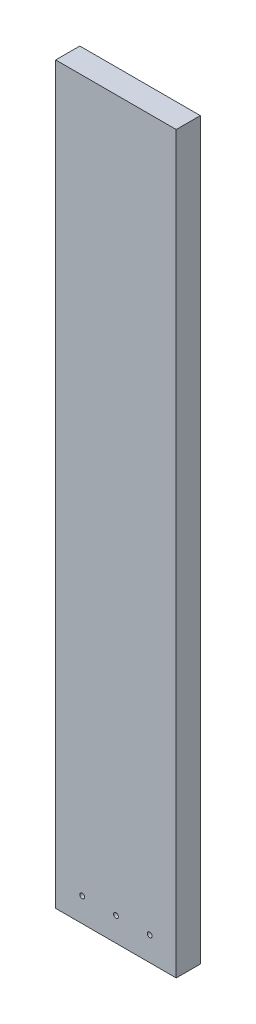
ISO-10303-21;
HEADER;
FILE_DESCRIPTION(('STEP AP214'),'2;1');
FILE_NAME('part.step','',(''),(''),'','','');
FILE_SCHEMA(('AUTOMOTIVE_DESIGN { 1 0 10303 214 1 1 1 1 }'));
ENDSEC;
DATA;
#1=APPLICATION_CONTEXT('core data for automotive mechanical design processes');
#2=APPLICATION_PROTOCOL_DEFINITION('international standard','automotive_design',2000,#1);
#3=PRODUCT_CONTEXT('',#1,'mechanical');
#4=PRODUCT('Part','Part','',(#3));
#5=PRODUCT_RELATED_PRODUCT_CATEGORY('part','',(#4));
#6=PRODUCT_DEFINITION_FORMATION('','',#4);
#7=PRODUCT_DEFINITION_CONTEXT('part definition',#1,'design');
#8=PRODUCT_DEFINITION('design','',#6,#7);
#9=PRODUCT_DEFINITION_SHAPE('','',#8);
#10=(LENGTH_UNIT() NAMED_UNIT(*) SI_UNIT(.MILLI.,.METRE.));
#11=(NAMED_UNIT(*) PLANE_ANGLE_UNIT() SI_UNIT($,.RADIAN.));
#12=(NAMED_UNIT(*) SI_UNIT($,.STERADIAN.) SOLID_ANGLE_UNIT());
#13=UNCERTAINTY_MEASURE_WITH_UNIT(LENGTH_MEASURE(1.E-05),#10,'distance_accuracy_value','');
#14=(GEOMETRIC_REPRESENTATION_CONTEXT(3) GLOBAL_UNCERTAINTY_ASSIGNED_CONTEXT((#13)) GLOBAL_UNIT_ASSIGNED_CONTEXT((#10,
#11,#12)) REPRESENTATION_CONTEXT('',''));
#15=CARTESIAN_POINT('',(0.,0.,0.));
#16=DIRECTION('',(0.,0.,1.));
#17=DIRECTION('',(1.,0.,0.));
#18=AXIS2_PLACEMENT_3D('',#15,#16,#17);
#19=CARTESIAN_POINT('',(0.,0.,10.));
#20=DIRECTION('',(0.,0.,1.));
#21=DIRECTION('',(1.,0.,0.));
#22=AXIS2_PLACEMENT_3D('',#19,#20,#21);
#23=PLANE('',#22);
#24=CARTESIAN_POINT('',(0.,-142.4,10.));
#25=DIRECTION('',(0.,0.,1.));
#26=DIRECTION('',(1.,0.,0.));
#27=AXIS2_PLACEMENT_3D('',#24,#25,#26);
#28=CIRCLE('',#27,1.);
#29=CARTESIAN_POINT('',(1.,-142.4,10.));
#30=VERTEX_POINT('',#29);
#31=EDGE_CURVE('E115',#30,#30,#28,.T.);
#32=ORIENTED_EDGE('',*,*,#31,.F.);
#33=EDGE_LOOP('',(#32));
#34=FACE_BOUND('',#33,.T.);
#35=DIRECTION('',(0.,-1.,0.));
#36=VECTOR('',#35,1.);
#37=CARTESIAN_POINT('',(-25.,152.4,10.));
#38=LINE('',#37,#36);
#39=CARTESIAN_POINT('',(-25.,152.4,10.));
#40=VERTEX_POINT('',#39);
#41=CARTESIAN_POINT('',(-25.,-152.4,10.));
#42=VERTEX_POINT('',#41);
#43=EDGE_CURVE('E85',#40,#42,#38,.T.);
#44=ORIENTED_EDGE('',*,*,#43,.T.);
#45=DIRECTION('',(1.,0.,0.));
#46=VECTOR('',#45,1.);
#47=CARTESIAN_POINT('',(-25.,-152.4,10.));
#48=LINE('',#47,#46);
#49=CARTESIAN_POINT('',(25.,-152.4,10.));
#50=VERTEX_POINT('',#49);
#51=EDGE_CURVE('E80',#42,#50,#48,.T.);
#52=ORIENTED_EDGE('',*,*,#51,.T.);
#53=DIRECTION('',(0.,1.,0.));
#54=VECTOR('',#53,1.);
#55=CARTESIAN_POINT('',(25.,152.4,10.));
#56=LINE('',#55,#54);
#57=CARTESIAN_POINT('',(25.,152.4,10.));
#58=VERTEX_POINT('',#57);
#59=EDGE_CURVE('E83',#50,#58,#56,.T.);
#60=ORIENTED_EDGE('',*,*,#59,.T.);
#61=DIRECTION('',(-1.,0.,0.));
#62=VECTOR('',#61,1.);
#63=CARTESIAN_POINT('',(-25.,152.4,10.));
#64=LINE('',#63,#62);
#65=EDGE_CURVE('E50',#58,#40,#64,.T.);
#66=ORIENTED_EDGE('',*,*,#65,.T.);
#67=EDGE_LOOP('',(#44,#52,#60,#66));
#68=FACE_BOUND('',#67,.T.);
#69=CARTESIAN_POINT('',(-14.,-142.4,10.));
#70=DIRECTION('',(0.,0.,1.));
#71=DIRECTION('',(1.,0.,0.));
#72=AXIS2_PLACEMENT_3D('',#69,#70,#71);
#73=CIRCLE('',#72,1.);
#74=CARTESIAN_POINT('',(-13.,-142.4,10.));
#75=VERTEX_POINT('',#74);
#76=EDGE_CURVE('E100',#75,#75,#73,.T.);
#77=ORIENTED_EDGE('',*,*,#76,.F.);
#78=EDGE_LOOP('',(#77));
#79=FACE_BOUND('',#78,.T.);
#80=CARTESIAN_POINT('',(14.,-142.4,10.));
#81=DIRECTION('',(0.,0.,1.));
#82=DIRECTION('',(1.,0.,0.));
#83=AXIS2_PLACEMENT_3D('',#80,#81,#82);
#84=CIRCLE('',#83,1.);
#85=CARTESIAN_POINT('',(15.,-142.4,10.));
#86=VERTEX_POINT('',#85);
#87=EDGE_CURVE('E121',#86,#86,#84,.T.);
#88=ORIENTED_EDGE('',*,*,#87,.F.);
#89=EDGE_LOOP('',(#88));
#90=FACE_BOUND('',#89,.T.);
#91=ADVANCED_FACE('F33',(#34,#68,#79,#90),#23,.T.);
#92=CARTESIAN_POINT('',(0.,0.,0.));
#93=DIRECTION('',(0.,0.,1.));
#94=DIRECTION('',(1.,0.,0.));
#95=AXIS2_PLACEMENT_3D('',#92,#93,#94);
#96=PLANE('',#95);
#97=CARTESIAN_POINT('',(0.,-142.4,0.));
#98=DIRECTION('',(0.,0.,1.));
#99=DIRECTION('',(1.,0.,0.));
#100=AXIS2_PLACEMENT_3D('',#97,#98,#99);
#101=CIRCLE('',#100,1.);
#102=CARTESIAN_POINT('',(1.,-142.4,0.));
#103=VERTEX_POINT('',#102);
#104=EDGE_CURVE('E118',#103,#103,#101,.T.);
#105=ORIENTED_EDGE('',*,*,#104,.T.);
#106=EDGE_LOOP('',(#105));
#107=FACE_BOUND('',#106,.T.);
#108=DIRECTION('',(0.,-1.,0.));
#109=VECTOR('',#108,1.);
#110=CARTESIAN_POINT('',(-25.,152.4,0.));
#111=LINE('',#110,#109);
#112=CARTESIAN_POINT('',(-25.,152.4,0.));
#113=VERTEX_POINT('',#112);
#114=CARTESIAN_POINT('',(-25.,-152.4,0.));
#115=VERTEX_POINT('',#114);
#116=EDGE_CURVE('E97',#113,#115,#111,.T.);
#117=ORIENTED_EDGE('',*,*,#116,.F.);
#118=DIRECTION('',(-1.,0.,0.));
#119=VECTOR('',#118,1.);
#120=CARTESIAN_POINT('',(-25.,152.4,0.));
#121=LINE('',#120,#119);
#122=CARTESIAN_POINT('',(25.,152.4,0.));
#123=VERTEX_POINT('',#122);
#124=EDGE_CURVE('E73',#123,#113,#121,.T.);
#125=ORIENTED_EDGE('',*,*,#124,.F.);
#126=DIRECTION('',(0.,1.,0.));
#127=VECTOR('',#126,1.);
#128=CARTESIAN_POINT('',(25.,152.4,0.));
#129=LINE('',#128,#127);
#130=CARTESIAN_POINT('',(25.,-152.4,0.));
#131=VERTEX_POINT('',#130);
#132=EDGE_CURVE('E67',#131,#123,#129,.T.);
#133=ORIENTED_EDGE('',*,*,#132,.F.);
#134=DIRECTION('',(1.,0.,0.));
#135=VECTOR('',#134,1.);
#136=CARTESIAN_POINT('',(-25.,-152.4,0.));
#137=LINE('',#136,#135);
#138=EDGE_CURVE('E89',#115,#131,#137,.T.);
#139=ORIENTED_EDGE('',*,*,#138,.F.);
#140=EDGE_LOOP('',(#117,#125,#133,#139));
#141=FACE_BOUND('',#140,.T.);
#142=CARTESIAN_POINT('',(-14.,-142.4,0.));
#143=DIRECTION('',(0.,0.,1.));
#144=DIRECTION('',(1.,0.,0.));
#145=AXIS2_PLACEMENT_3D('',#142,#143,#144);
#146=CIRCLE('',#145,1.);
#147=CARTESIAN_POINT('',(-13.,-142.4,0.));
#148=VERTEX_POINT('',#147);
#149=EDGE_CURVE('E112',#148,#148,#146,.T.);
#150=ORIENTED_EDGE('',*,*,#149,.T.);
#151=EDGE_LOOP('',(#150));
#152=FACE_BOUND('',#151,.T.);
#153=CARTESIAN_POINT('',(14.,-142.4,0.));
#154=DIRECTION('',(0.,0.,1.));
#155=DIRECTION('',(1.,0.,0.));
#156=AXIS2_PLACEMENT_3D('',#153,#154,#155);
#157=CIRCLE('',#156,1.);
#158=CARTESIAN_POINT('',(15.,-142.4,0.));
#159=VERTEX_POINT('',#158);
#160=EDGE_CURVE('E124',#159,#159,#157,.T.);
#161=ORIENTED_EDGE('',*,*,#160,.T.);
#162=EDGE_LOOP('',(#161));
#163=FACE_BOUND('',#162,.T.);
#164=ADVANCED_FACE('F108',(#107,#141,#152,#163),#96,.F.);
#165=CARTESIAN_POINT('',(-25.,152.4,10.));
#166=DIRECTION('',(1.,0.,0.));
#167=DIRECTION('',(0.,0.,-1.));
#168=AXIS2_PLACEMENT_3D('',#165,#166,#167);
#169=PLANE('',#168);
#170=ORIENTED_EDGE('',*,*,#116,.T.);
#171=DIRECTION('',(0.,0.,-1.));
#172=VECTOR('',#171,1.);
#173=CARTESIAN_POINT('',(-25.,-152.4,10.));
#174=LINE('',#173,#172);
#175=EDGE_CURVE('E11',#42,#115,#174,.T.);
#176=ORIENTED_EDGE('',*,*,#175,.F.);
#177=ORIENTED_EDGE('',*,*,#43,.F.);
#178=DIRECTION('',(0.,0.,-1.));
#179=VECTOR('',#178,1.);
#180=CARTESIAN_POINT('',(-25.,152.4,10.));
#181=LINE('',#180,#179);
#182=EDGE_CURVE('E93',#40,#113,#181,.T.);
#183=ORIENTED_EDGE('',*,*,#182,.T.);
#184=EDGE_LOOP('',(#170,#176,#177,#183));
#185=FACE_BOUND('',#184,.T.);
#186=ADVANCED_FACE('F35',(#185),#169,.F.);
#187=CARTESIAN_POINT('',(-25.,-152.4,10.));
#188=DIRECTION('',(0.,1.,0.));
#189=DIRECTION('',(0.,0.,1.));
#190=AXIS2_PLACEMENT_3D('',#187,#188,#189);
#191=PLANE('',#190);
#192=ORIENTED_EDGE('',*,*,#138,.T.);
#193=DIRECTION('',(0.,0.,-1.));
#194=VECTOR('',#193,1.);
#195=CARTESIAN_POINT('',(25.,-152.4,10.));
#196=LINE('',#195,#194);
#197=EDGE_CURVE('E42',#50,#131,#196,.T.);
#198=ORIENTED_EDGE('',*,*,#197,.F.);
#199=ORIENTED_EDGE('',*,*,#51,.F.);
#200=ORIENTED_EDGE('',*,*,#175,.T.);
#201=EDGE_LOOP('',(#192,#198,#199,#200));
#202=FACE_BOUND('',#201,.T.);
#203=ADVANCED_FACE('F88',(#202),#191,.F.);
#204=CARTESIAN_POINT('',(25.,152.4,10.));
#205=DIRECTION('',(-1.,0.,0.));
#206=DIRECTION('',(0.,-1.,0.));
#207=AXIS2_PLACEMENT_3D('',#204,#205,#206);
#208=PLANE('',#207);
#209=ORIENTED_EDGE('',*,*,#132,.T.);
#210=DIRECTION('',(0.,0.,-1.));
#211=VECTOR('',#210,1.);
#212=CARTESIAN_POINT('',(25.,152.4,10.));
#213=LINE('',#212,#211);
#214=EDGE_CURVE('E90',#58,#123,#213,.T.);
#215=ORIENTED_EDGE('',*,*,#214,.F.);
#216=ORIENTED_EDGE('',*,*,#59,.F.);
#217=ORIENTED_EDGE('',*,*,#197,.T.);
#218=EDGE_LOOP('',(#209,#215,#216,#217));
#219=FACE_BOUND('',#218,.T.);
#220=ADVANCED_FACE('F91',(#219),#208,.F.);
#221=CARTESIAN_POINT('',(-25.,152.4,10.));
#222=DIRECTION('',(0.,-1.,0.));
#223=DIRECTION('',(0.,0.,-1.));
#224=AXIS2_PLACEMENT_3D('',#221,#222,#223);
#225=PLANE('',#224);
#226=ORIENTED_EDGE('',*,*,#124,.T.);
#227=ORIENTED_EDGE('',*,*,#182,.F.);
#228=ORIENTED_EDGE('',*,*,#65,.F.);
#229=ORIENTED_EDGE('',*,*,#214,.T.);
#230=EDGE_LOOP('',(#226,#227,#228,#229));
#231=FACE_BOUND('',#230,.T.);
#232=ADVANCED_FACE('F105',(#231),#225,.F.);
#233=CARTESIAN_POINT('',(-14.,-142.4,10.));
#234=DIRECTION('',(0.,0.,-1.));
#235=DIRECTION('',(-1.,0.,0.));
#236=AXIS2_PLACEMENT_3D('',#233,#234,#235);
#237=CYLINDRICAL_SURFACE('',#236,1.);
#238=ORIENTED_EDGE('',*,*,#76,.T.);
#239=EDGE_LOOP('',(#238));
#240=FACE_BOUND('',#239,.T.);
#241=ORIENTED_EDGE('',*,*,#149,.F.);
#242=EDGE_LOOP('',(#241));
#243=FACE_BOUND('',#242,.T.);
#244=ADVANCED_FACE('F143',(#240,#243),#237,.F.);
#245=CARTESIAN_POINT('',(0.,-142.4,10.));
#246=DIRECTION('',(0.,0.,-1.));
#247=DIRECTION('',(-1.,0.,0.));
#248=AXIS2_PLACEMENT_3D('',#245,#246,#247);
#249=CYLINDRICAL_SURFACE('',#248,1.);
#250=ORIENTED_EDGE('',*,*,#31,.T.);
#251=EDGE_LOOP('',(#250));
#252=FACE_BOUND('',#251,.T.);
#253=ORIENTED_EDGE('',*,*,#104,.F.);
#254=EDGE_LOOP('',(#253));
#255=FACE_BOUND('',#254,.T.);
#256=ADVANCED_FACE('F189',(#252,#255),#249,.F.);
#257=CARTESIAN_POINT('',(14.,-142.4,10.));
#258=DIRECTION('',(0.,0.,-1.));
#259=DIRECTION('',(-1.,0.,0.));
#260=AXIS2_PLACEMENT_3D('',#257,#258,#259);
#261=CYLINDRICAL_SURFACE('',#260,1.);
#262=ORIENTED_EDGE('',*,*,#87,.T.);
#263=EDGE_LOOP('',(#262));
#264=FACE_BOUND('',#263,.T.);
#265=ORIENTED_EDGE('',*,*,#160,.F.);
#266=EDGE_LOOP('',(#265));
#267=FACE_BOUND('',#266,.T.);
#268=ADVANCED_FACE('F130',(#264,#267),#261,.F.);
#269=CLOSED_SHELL('',(#91,#164,#186,#203,#220,#232,#244,#256,#268));
#270=MANIFOLD_SOLID_BREP('B2',#269);
#271=ADVANCED_BREP_SHAPE_REPRESENTATION('',(#18,#270),#14);
#272=SHAPE_DEFINITION_REPRESENTATION(#9,#271);
ENDSEC;
END-ISO-10303-21;
